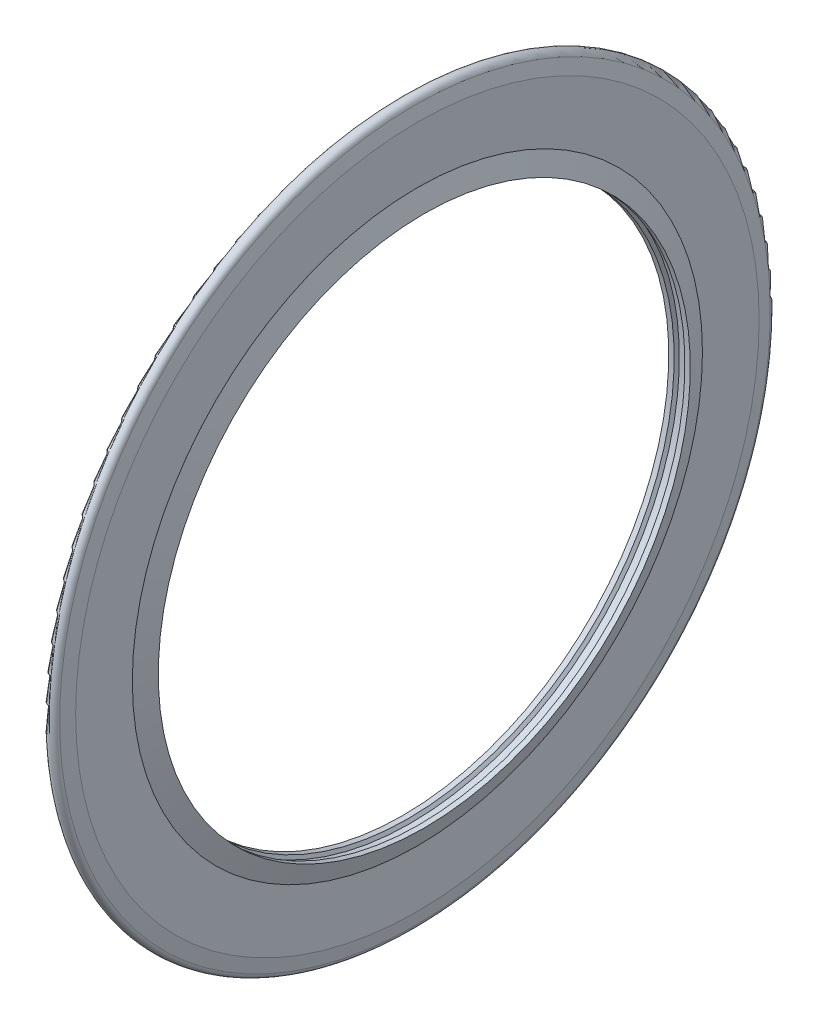
ISO-10303-21;
HEADER;
FILE_DESCRIPTION(('STEP AP214'),'2;1');
FILE_NAME('part.step','',(''),(''),'','','');
FILE_SCHEMA(('AUTOMOTIVE_DESIGN { 1 0 10303 214 1 1 1 1 }'));
ENDSEC;
DATA;
#1=APPLICATION_CONTEXT('core data for automotive mechanical design processes');
#2=APPLICATION_PROTOCOL_DEFINITION('international standard','automotive_design',2000,#1);
#3=PRODUCT_CONTEXT('',#1,'mechanical');
#4=PRODUCT('Part','Part','',(#3));
#5=PRODUCT_RELATED_PRODUCT_CATEGORY('part','',(#4));
#6=PRODUCT_DEFINITION_FORMATION('','',#4);
#7=PRODUCT_DEFINITION_CONTEXT('part definition',#1,'design');
#8=PRODUCT_DEFINITION('design','',#6,#7);
#9=PRODUCT_DEFINITION_SHAPE('','',#8);
#10=(LENGTH_UNIT() NAMED_UNIT(*) SI_UNIT(.MILLI.,.METRE.));
#11=(NAMED_UNIT(*) PLANE_ANGLE_UNIT() SI_UNIT($,.RADIAN.));
#12=(NAMED_UNIT(*) SI_UNIT($,.STERADIAN.) SOLID_ANGLE_UNIT());
#13=UNCERTAINTY_MEASURE_WITH_UNIT(LENGTH_MEASURE(1.E-05),#10,'distance_accuracy_value','');
#14=(GEOMETRIC_REPRESENTATION_CONTEXT(3) GLOBAL_UNCERTAINTY_ASSIGNED_CONTEXT((#13)) GLOBAL_UNIT_ASSIGNED_CONTEXT((#10,
#11,#12)) REPRESENTATION_CONTEXT('',''));
#15=CARTESIAN_POINT('',(0.,0.,0.));
#16=DIRECTION('',(0.,0.,1.));
#17=DIRECTION('',(1.,0.,0.));
#18=AXIS2_PLACEMENT_3D('',#15,#16,#17);
#19=CARTESIAN_POINT('',(0.165,0.,0.));
#20=DIRECTION('',(-1.,0.,0.));
#21=DIRECTION('',(0.,1.,0.));
#22=AXIS2_PLACEMENT_3D('',#19,#20,#21);
#23=CONICAL_SURFACE('',#22,12.08765,0.785398163397453);
#24=CARTESIAN_POINT('',(0.22,0.,0.));
#25=DIRECTION('',(1.,0.,0.));
#26=DIRECTION('',(0.,1.,0.));
#27=AXIS2_PLACEMENT_3D('',#24,#25,#26);
#28=CIRCLE('',#27,12.03265);
#29=CARTESIAN_POINT('',(0.22,12.03265,0.));
#30=VERTEX_POINT('',#29);
#31=EDGE_CURVE('E11',#30,#30,#28,.T.);
#32=ORIENTED_EDGE('',*,*,#31,.T.);
#33=EDGE_LOOP('',(#32));
#34=FACE_BOUND('',#33,.T.);
#35=CARTESIAN_POINT('',(0.11,0.,0.));
#36=DIRECTION('',(1.,0.,0.));
#37=DIRECTION('',(0.,1.,0.));
#38=AXIS2_PLACEMENT_3D('',#35,#36,#37);
#39=CIRCLE('',#38,12.14265);
#40=CARTESIAN_POINT('',(0.11,12.14265,0.));
#41=VERTEX_POINT('',#40);
#42=EDGE_CURVE('E84',#41,#41,#39,.T.);
#43=ORIENTED_EDGE('',*,*,#42,.F.);
#44=EDGE_LOOP('',(#43));
#45=FACE_BOUND('',#44,.T.);
#46=ADVANCED_FACE('F16',(#34,#45),#23,.F.);
#47=CARTESIAN_POINT('',(0.22,11.0864,0.));
#48=DIRECTION('',(-1.,0.,0.));
#49=DIRECTION('',(0.,-1.,0.));
#50=AXIS2_PLACEMENT_3D('',#47,#48,#49);
#51=PLANE('',#50);
#52=CARTESIAN_POINT('',(0.22,0.,0.));
#53=DIRECTION('',(1.,0.,0.));
#54=DIRECTION('',(0.,1.,0.));
#55=AXIS2_PLACEMENT_3D('',#52,#53,#54);
#56=CIRCLE('',#55,10.14015);
#57=CARTESIAN_POINT('',(0.22,10.14015,0.));
#58=VERTEX_POINT('',#57);
#59=EDGE_CURVE('E26',#58,#58,#56,.T.);
#60=ORIENTED_EDGE('',*,*,#59,.T.);
#61=EDGE_LOOP('',(#60));
#62=FACE_BOUND('',#61,.T.);
#63=ORIENTED_EDGE('',*,*,#31,.F.);
#64=EDGE_LOOP('',(#63));
#65=FACE_BOUND('',#64,.T.);
#66=ADVANCED_FACE('F115',(#62,#65),#51,.T.);
#67=CARTESIAN_POINT('',(0.165,0.,0.));
#68=DIRECTION('',(1.,0.,0.));
#69=DIRECTION('',(0.,1.,0.));
#70=AXIS2_PLACEMENT_3D('',#67,#68,#69);
#71=CONICAL_SURFACE('',#70,10.08515,0.785398163397445);
#72=CARTESIAN_POINT('',(0.11,0.,0.));
#73=DIRECTION('',(1.,0.,0.));
#74=DIRECTION('',(0.,1.,0.));
#75=AXIS2_PLACEMENT_3D('',#72,#73,#74);
#76=CIRCLE('',#75,10.03015);
#77=CARTESIAN_POINT('',(0.11,10.03015,0.));
#78=VERTEX_POINT('',#77);
#79=EDGE_CURVE('E62',#78,#78,#76,.T.);
#80=ORIENTED_EDGE('',*,*,#79,.T.);
#81=EDGE_LOOP('',(#80));
#82=FACE_BOUND('',#81,.T.);
#83=ORIENTED_EDGE('',*,*,#59,.F.);
#84=EDGE_LOOP('',(#83));
#85=FACE_BOUND('',#84,.T.);
#86=ADVANCED_FACE('F63',(#82,#85),#71,.T.);
#87=CARTESIAN_POINT('',(0.11,9.769075,0.));
#88=DIRECTION('',(-1.,0.,0.));
#89=DIRECTION('',(0.,-1.,0.));
#90=AXIS2_PLACEMENT_3D('',#87,#88,#89);
#91=PLANE('',#90);
#92=CARTESIAN_POINT('',(0.11,0.,0.));
#93=DIRECTION('',(1.,0.,0.));
#94=DIRECTION('',(0.,1.,0.));
#95=AXIS2_PLACEMENT_3D('',#92,#93,#94);
#96=CIRCLE('',#95,9.508);
#97=CARTESIAN_POINT('',(0.11,9.508,0.));
#98=VERTEX_POINT('',#97);
#99=EDGE_CURVE('E20',#98,#98,#96,.T.);
#100=ORIENTED_EDGE('',*,*,#99,.T.);
#101=EDGE_LOOP('',(#100));
#102=FACE_BOUND('',#101,.T.);
#103=ORIENTED_EDGE('',*,*,#79,.F.);
#104=EDGE_LOOP('',(#103));
#105=FACE_BOUND('',#104,.T.);
#106=ADVANCED_FACE('F158',(#102,#105),#91,.T.);
#107=CARTESIAN_POINT('',(0.20625,0.,0.));
#108=DIRECTION('',(-1.,0.,0.));
#109=DIRECTION('',(0.,1.,0.));
#110=AXIS2_PLACEMENT_3D('',#107,#108,#109);
#111=CYLINDRICAL_SURFACE('',#110,9.508);
#112=CARTESIAN_POINT('',(0.3025,0.,0.));
#113=DIRECTION('',(1.,0.,0.));
#114=DIRECTION('',(0.,1.,0.));
#115=AXIS2_PLACEMENT_3D('',#112,#113,#114);
#116=CIRCLE('',#115,9.508);
#117=CARTESIAN_POINT('',(0.3025,9.508,0.));
#118=VERTEX_POINT('',#117);
#119=EDGE_CURVE('E68',#118,#118,#116,.T.);
#120=ORIENTED_EDGE('',*,*,#119,.T.);
#121=EDGE_LOOP('',(#120));
#122=FACE_BOUND('',#121,.T.);
#123=ORIENTED_EDGE('',*,*,#99,.F.);
#124=EDGE_LOOP('',(#123));
#125=FACE_BOUND('',#124,.T.);
#126=ADVANCED_FACE('F156',(#122,#125),#111,.F.);
#127=CARTESIAN_POINT('',(0.341011414601534,0.,0.));
#128=DIRECTION('',(1.,0.,0.));
#129=DIRECTION('',(0.,1.,0.));
#130=AXIS2_PLACEMENT_3D('',#127,#128,#129);
#131=CONICAL_SURFACE('',#130,9.563,0.959931088596883);
#132=CARTESIAN_POINT('',(0.379522829203068,0.,0.));
#133=DIRECTION('',(1.,0.,0.));
#134=DIRECTION('',(0.,1.,0.));
#135=AXIS2_PLACEMENT_3D('',#132,#133,#134);
#136=CIRCLE('',#135,9.618);
#137=CARTESIAN_POINT('',(0.379522829203068,9.618,0.));
#138=VERTEX_POINT('',#137);
#139=EDGE_CURVE('E70',#138,#138,#136,.T.);
#140=ORIENTED_EDGE('',*,*,#139,.T.);
#141=EDGE_LOOP('',(#140));
#142=FACE_BOUND('',#141,.T.);
#143=ORIENTED_EDGE('',*,*,#119,.F.);
#144=EDGE_LOOP('',(#143));
#145=FACE_BOUND('',#144,.T.);
#146=ADVANCED_FACE('F123',(#142,#145),#131,.F.);
#147=CARTESIAN_POINT('',(0.495,0.,0.));
#148=DIRECTION('',(-1.,0.,0.));
#149=DIRECTION('',(0.,1.,0.));
#150=AXIS2_PLACEMENT_3D('',#147,#148,#149);
#151=CYLINDRICAL_SURFACE('',#150,9.618);
#152=CARTESIAN_POINT('',(0.610477170796933,0.,0.));
#153=DIRECTION('',(1.,0.,0.));
#154=DIRECTION('',(0.,1.,0.));
#155=AXIS2_PLACEMENT_3D('',#152,#153,#154);
#156=CIRCLE('',#155,9.618);
#157=CARTESIAN_POINT('',(0.610477170796933,9.618,0.));
#158=VERTEX_POINT('',#157);
#159=EDGE_CURVE('E72',#158,#158,#156,.T.);
#160=ORIENTED_EDGE('',*,*,#159,.T.);
#161=EDGE_LOOP('',(#160));
#162=FACE_BOUND('',#161,.T.);
#163=ORIENTED_EDGE('',*,*,#139,.F.);
#164=EDGE_LOOP('',(#163));
#165=FACE_BOUND('',#164,.T.);
#166=ADVANCED_FACE('F127',(#162,#165),#151,.F.);
#167=CARTESIAN_POINT('',(0.648988585398467,0.,0.));
#168=DIRECTION('',(-1.,0.,0.));
#169=DIRECTION('',(0.,1.,0.));
#170=AXIS2_PLACEMENT_3D('',#167,#168,#169);
#171=CONICAL_SURFACE('',#170,9.563,0.95993108859688);
#172=CARTESIAN_POINT('',(0.6875,0.,0.));
#173=DIRECTION('',(1.,0.,0.));
#174=DIRECTION('',(0.,1.,0.));
#175=AXIS2_PLACEMENT_3D('',#172,#173,#174);
#176=CIRCLE('',#175,9.508);
#177=CARTESIAN_POINT('',(0.6875,9.508,0.));
#178=VERTEX_POINT('',#177);
#179=EDGE_CURVE('E76',#178,#178,#176,.T.);
#180=ORIENTED_EDGE('',*,*,#179,.T.);
#181=EDGE_LOOP('',(#180));
#182=FACE_BOUND('',#181,.T.);
#183=ORIENTED_EDGE('',*,*,#159,.F.);
#184=EDGE_LOOP('',(#183));
#185=FACE_BOUND('',#184,.T.);
#186=ADVANCED_FACE('F124',(#182,#185),#171,.F.);
#187=CARTESIAN_POINT('',(0.78375,0.,0.));
#188=DIRECTION('',(-1.,0.,0.));
#189=DIRECTION('',(0.,1.,0.));
#190=AXIS2_PLACEMENT_3D('',#187,#188,#189);
#191=CYLINDRICAL_SURFACE('',#190,9.508);
#192=CARTESIAN_POINT('',(0.88,0.,0.));
#193=DIRECTION('',(1.,0.,0.));
#194=DIRECTION('',(0.,1.,0.));
#195=AXIS2_PLACEMENT_3D('',#192,#193,#194);
#196=CIRCLE('',#195,9.508);
#197=CARTESIAN_POINT('',(0.88,9.508,0.));
#198=VERTEX_POINT('',#197);
#199=EDGE_CURVE('E81',#198,#198,#196,.T.);
#200=ORIENTED_EDGE('',*,*,#199,.T.);
#201=EDGE_LOOP('',(#200));
#202=FACE_BOUND('',#201,.T.);
#203=ORIENTED_EDGE('',*,*,#179,.F.);
#204=EDGE_LOOP('',(#203));
#205=FACE_BOUND('',#204,.T.);
#206=ADVANCED_FACE('F126',(#202,#205),#191,.F.);
#207=CARTESIAN_POINT('',(0.75625,0.,0.));
#208=DIRECTION('',(-1.,0.,0.));
#209=DIRECTION('',(0.,1.,0.));
#210=AXIS2_PLACEMENT_3D('',#207,#208,#209);
#211=CONICAL_SURFACE('',#210,9.84800033065751,1.22173047639603);
#212=CARTESIAN_POINT('',(0.6325,0.,0.));
#213=DIRECTION('',(1.,0.,0.));
#214=DIRECTION('',(0.,1.,0.));
#215=AXIS2_PLACEMENT_3D('',#212,#213,#214);
#216=CIRCLE('',#215,10.188000661315);
#217=CARTESIAN_POINT('',(0.6325,10.188000661315,0.));
#218=VERTEX_POINT('',#217);
#219=EDGE_CURVE('E90',#218,#218,#216,.T.);
#220=ORIENTED_EDGE('',*,*,#219,.T.);
#221=EDGE_LOOP('',(#220));
#222=FACE_BOUND('',#221,.T.);
#223=ORIENTED_EDGE('',*,*,#199,.F.);
#224=EDGE_LOOP('',(#223));
#225=FACE_BOUND('',#224,.T.);
#226=ADVANCED_FACE('F133',(#222,#225),#211,.T.);
#227=CARTESIAN_POINT('',(0.6325,11.2010087085861,0.));
#228=DIRECTION('',(1.,0.,0.));
#229=DIRECTION('',(0.,1.,0.));
#230=AXIS2_PLACEMENT_3D('',#227,#228,#229);
#231=PLANE('',#230);
#232=CARTESIAN_POINT('',(0.6325,0.,0.));
#233=DIRECTION('',(1.,0.,0.));
#234=DIRECTION('',(0.,1.,0.));
#235=AXIS2_PLACEMENT_3D('',#232,#233,#234);
#236=CIRCLE('',#235,12.2140167558572);
#237=CARTESIAN_POINT('',(0.6325,12.2140167558572,0.));
#238=VERTEX_POINT('',#237);
#239=EDGE_CURVE('E88',#238,#238,#236,.T.);
#240=ORIENTED_EDGE('',*,*,#239,.T.);
#241=EDGE_LOOP('',(#240));
#242=FACE_BOUND('',#241,.T.);
#243=ORIENTED_EDGE('',*,*,#219,.F.);
#244=EDGE_LOOP('',(#243));
#245=FACE_BOUND('',#244,.T.);
#246=ADVANCED_FACE('F111',(#242,#245),#231,.T.);
#247=CARTESIAN_POINT('',(0.589578852831344,0.,0.));
#248=DIRECTION('',(-1.,0.,0.));
#249=DIRECTION('',(0.,1.,0.));
#250=AXIS2_PLACEMENT_3D('',#247,#248,#249);
#251=CONICAL_SURFACE('',#250,12.457434677472,1.39626340159546);
#252=CARTESIAN_POINT('',(0.546657705662687,0.,0.));
#253=DIRECTION('',(1.,0.,0.));
#254=DIRECTION('',(0.,1.,0.));
#255=AXIS2_PLACEMENT_3D('',#252,#253,#254);
#256=CIRCLE('',#255,12.7008525990867);
#257=CARTESIAN_POINT('',(0.546657705662687,12.7008525990867,0.));
#258=VERTEX_POINT('',#257);
#259=EDGE_CURVE('E86',#258,#258,#256,.T.);
#260=ORIENTED_EDGE('',*,*,#259,.T.);
#261=EDGE_LOOP('',(#260));
#262=FACE_BOUND('',#261,.T.);
#263=ORIENTED_EDGE('',*,*,#239,.F.);
#264=EDGE_LOOP('',(#263));
#265=FACE_BOUND('',#264,.T.);
#266=ADVANCED_FACE('F18',(#262,#265),#251,.T.);
#267=CARTESIAN_POINT('',(0.33,0.,0.));
#268=DIRECTION('',(1.,0.,0.));
#269=DIRECTION('',(0.,0.,-1.));
#270=AXIS2_PLACEMENT_3D('',#267,#268,#269);
#271=TOROIDAL_SURFACE('',#270,12.66265,0.22);
#272=CARTESIAN_POINT('',(0.11,0.,0.));
#273=DIRECTION('',(1.,0.,0.));
#274=DIRECTION('',(0.,1.,0.));
#275=AXIS2_PLACEMENT_3D('',#272,#273,#274);
#276=CIRCLE('',#275,12.66265);
#277=CARTESIAN_POINT('',(0.11,12.66265,0.));
#278=VERTEX_POINT('',#277);
#279=EDGE_CURVE('E87',#278,#278,#276,.T.);
#280=ORIENTED_EDGE('',*,*,#279,.T.);
#281=EDGE_LOOP('',(#280));
#282=FACE_BOUND('',#281,.T.);
#283=ORIENTED_EDGE('',*,*,#259,.F.);
#284=EDGE_LOOP('',(#283));
#285=FACE_BOUND('',#284,.T.);
#286=ADVANCED_FACE('F99',(#282,#285),#271,.T.);
#287=CARTESIAN_POINT('',(0.11,12.40265,0.));
#288=DIRECTION('',(-1.,0.,0.));
#289=DIRECTION('',(0.,-1.,0.));
#290=AXIS2_PLACEMENT_3D('',#287,#288,#289);
#291=PLANE('',#290);
#292=ORIENTED_EDGE('',*,*,#42,.T.);
#293=EDGE_LOOP('',(#292));
#294=FACE_BOUND('',#293,.T.);
#295=ORIENTED_EDGE('',*,*,#279,.F.);
#296=EDGE_LOOP('',(#295));
#297=FACE_BOUND('',#296,.T.);
#298=ADVANCED_FACE('F101',(#294,#297),#291,.T.);
#299=CLOSED_SHELL('',(#46,#66,#86,#106,#126,#146,#166,#186,#206,#226,#246,#266,#286,#298));
#300=MANIFOLD_SOLID_BREP('B1',#299);
#301=ADVANCED_BREP_SHAPE_REPRESENTATION('',(#18,#300),#14);
#302=SHAPE_DEFINITION_REPRESENTATION(#9,#301);
ENDSEC;
END-ISO-10303-21;
